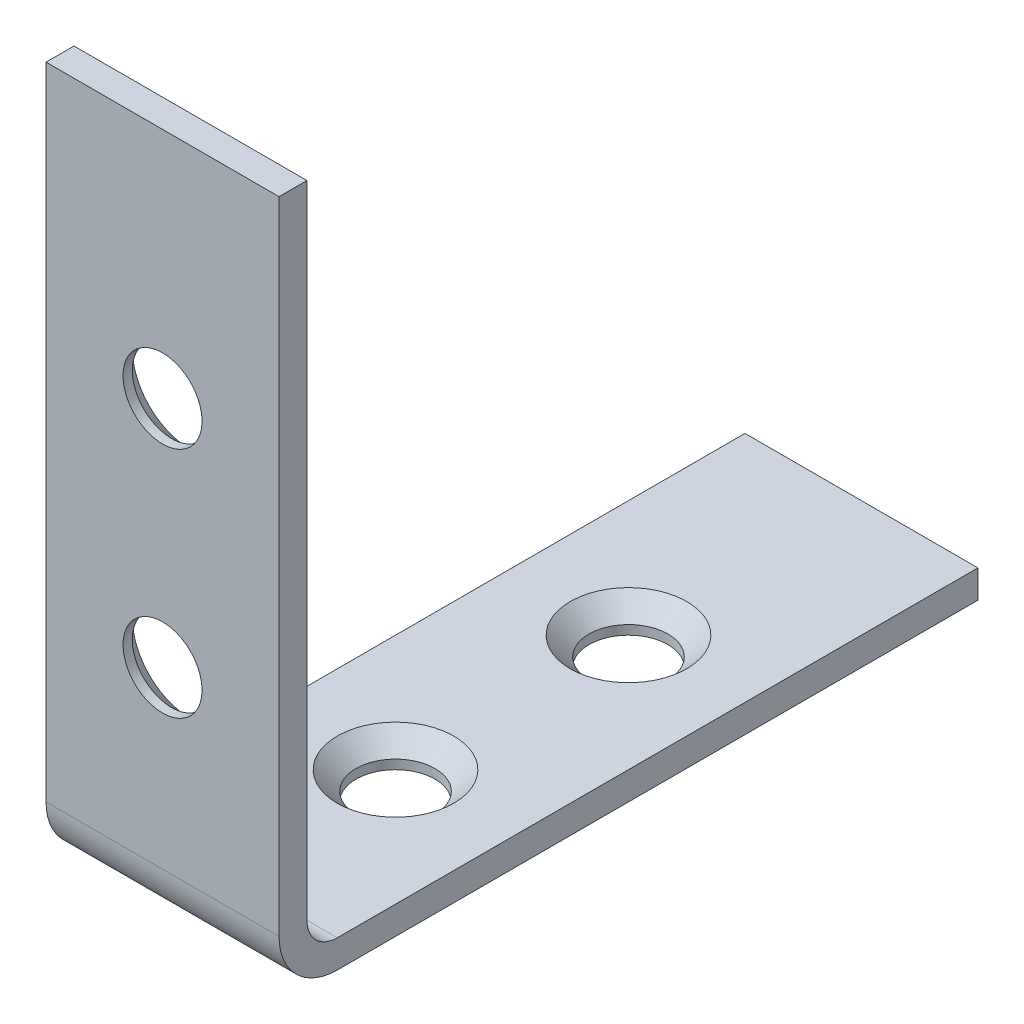
ISO-10303-21;
HEADER;
FILE_DESCRIPTION(('STEP AP214'),'2;1');
FILE_NAME('part.step','',(''),(''),'','','');
FILE_SCHEMA(('AUTOMOTIVE_DESIGN { 1 0 10303 214 1 1 1 1 }'));
ENDSEC;
DATA;
#1=APPLICATION_CONTEXT('core data for automotive mechanical design processes');
#2=APPLICATION_PROTOCOL_DEFINITION('international standard','automotive_design',2000,#1);
#3=PRODUCT_CONTEXT('',#1,'mechanical');
#4=PRODUCT('Part','Part','',(#3));
#5=PRODUCT_RELATED_PRODUCT_CATEGORY('part','',(#4));
#6=PRODUCT_DEFINITION_FORMATION('','',#4);
#7=PRODUCT_DEFINITION_CONTEXT('part definition',#1,'design');
#8=PRODUCT_DEFINITION('design','',#6,#7);
#9=PRODUCT_DEFINITION_SHAPE('','',#8);
#10=(LENGTH_UNIT() NAMED_UNIT(*) SI_UNIT(.MILLI.,.METRE.));
#11=(NAMED_UNIT(*) PLANE_ANGLE_UNIT() SI_UNIT($,.RADIAN.));
#12=(NAMED_UNIT(*) SI_UNIT($,.STERADIAN.) SOLID_ANGLE_UNIT());
#13=UNCERTAINTY_MEASURE_WITH_UNIT(LENGTH_MEASURE(1.E-05),#10,'distance_accuracy_value','');
#14=(GEOMETRIC_REPRESENTATION_CONTEXT(3) GLOBAL_UNCERTAINTY_ASSIGNED_CONTEXT((#13)) GLOBAL_UNIT_ASSIGNED_CONTEXT((#10,
#11,#12)) REPRESENTATION_CONTEXT('',''));
#15=CARTESIAN_POINT('',(0.,0.,0.));
#16=DIRECTION('',(0.,0.,1.));
#17=DIRECTION('',(1.,0.,0.));
#18=AXIS2_PLACEMENT_3D('',#15,#16,#17);
#19=CARTESIAN_POINT('',(6.35,38.1,0.));
#20=DIRECTION('',(0.,-1.,0.));
#21=DIRECTION('',(0.,0.,-1.));
#22=AXIS2_PLACEMENT_3D('',#19,#20,#21);
#23=PLANE('',#22);
#24=DIRECTION('',(0.,0.,1.));
#25=VECTOR('',#24,1.);
#26=CARTESIAN_POINT('',(-6.35,38.1,0.));
#27=LINE('',#26,#25);
#28=CARTESIAN_POINT('',(-6.35,38.1,-1.524));
#29=VERTEX_POINT('',#28);
#30=CARTESIAN_POINT('',(-6.35,38.1,0.));
#31=VERTEX_POINT('',#30);
#32=EDGE_CURVE('E134',#29,#31,#27,.T.);
#33=ORIENTED_EDGE('',*,*,#32,.T.);
#34=DIRECTION('',(-1.,0.,0.));
#35=VECTOR('',#34,1.);
#36=CARTESIAN_POINT('',(6.35,38.1,0.));
#37=LINE('',#36,#35);
#38=CARTESIAN_POINT('',(6.35,38.1,0.));
#39=VERTEX_POINT('',#38);
#40=EDGE_CURVE('E11',#39,#31,#37,.T.);
#41=ORIENTED_EDGE('',*,*,#40,.F.);
#42=DIRECTION('',(0.,0.,1.));
#43=VECTOR('',#42,1.);
#44=CARTESIAN_POINT('',(6.35,38.1,0.));
#45=LINE('',#44,#43);
#46=CARTESIAN_POINT('',(6.35,38.1,-1.524));
#47=VERTEX_POINT('',#46);
#48=EDGE_CURVE('E149',#47,#39,#45,.T.);
#49=ORIENTED_EDGE('',*,*,#48,.F.);
#50=DIRECTION('',(-1.,0.,0.));
#51=VECTOR('',#50,1.);
#52=CARTESIAN_POINT('',(6.35,38.1,-1.524));
#53=LINE('',#52,#51);
#54=EDGE_CURVE('E130',#47,#29,#53,.T.);
#55=ORIENTED_EDGE('',*,*,#54,.T.);
#56=EDGE_LOOP('',(#33,#41,#49,#55));
#57=FACE_BOUND('',#56,.T.);
#58=ADVANCED_FACE('F38',(#57),#23,.F.);
#59=CARTESIAN_POINT('',(6.35,3.175,0.));
#60=DIRECTION('',(0.,0.,-1.));
#61=DIRECTION('',(-1.,0.,0.));
#62=AXIS2_PLACEMENT_3D('',#59,#60,#61);
#63=PLANE('',#62);
#64=CARTESIAN_POINT('',(0.,12.7,0.));
#65=DIRECTION('',(0.,0.,-1.));
#66=DIRECTION('',(0.,1.,0.));
#67=AXIS2_PLACEMENT_3D('',#64,#65,#66);
#68=CIRCLE('',#67,2.15265);
#69=CARTESIAN_POINT('',(0.,14.85265,0.));
#70=VERTEX_POINT('',#69);
#71=EDGE_CURVE('E208',#70,#70,#68,.T.);
#72=ORIENTED_EDGE('',*,*,#71,.T.);
#73=EDGE_LOOP('',(#72));
#74=FACE_BOUND('',#73,.T.);
#75=CARTESIAN_POINT('',(0.,25.4,0.));
#76=DIRECTION('',(0.,0.,-1.));
#77=DIRECTION('',(0.,1.,0.));
#78=AXIS2_PLACEMENT_3D('',#75,#76,#77);
#79=CIRCLE('',#78,2.15265);
#80=CARTESIAN_POINT('',(0.,27.55265,0.));
#81=VERTEX_POINT('',#80);
#82=EDGE_CURVE('E199',#81,#81,#79,.T.);
#83=ORIENTED_EDGE('',*,*,#82,.T.);
#84=EDGE_LOOP('',(#83));
#85=FACE_BOUND('',#84,.T.);
#86=DIRECTION('',(0.,-1.,0.));
#87=VECTOR('',#86,1.);
#88=CARTESIAN_POINT('',(-6.35,3.175,0.));
#89=LINE('',#88,#87);
#90=CARTESIAN_POINT('',(-6.35,3.175,0.));
#91=VERTEX_POINT('',#90);
#92=EDGE_CURVE('E137',#31,#91,#89,.T.);
#93=ORIENTED_EDGE('',*,*,#92,.T.);
#94=DIRECTION('',(-1.,0.,0.));
#95=VECTOR('',#94,1.);
#96=CARTESIAN_POINT('',(6.35,3.175,0.));
#97=LINE('',#96,#95);
#98=CARTESIAN_POINT('',(6.35,3.175,0.));
#99=VERTEX_POINT('',#98);
#100=EDGE_CURVE('E46',#99,#91,#97,.T.);
#101=ORIENTED_EDGE('',*,*,#100,.F.);
#102=DIRECTION('',(0.,-1.,0.));
#103=VECTOR('',#102,1.);
#104=CARTESIAN_POINT('',(6.35,3.175,0.));
#105=LINE('',#104,#103);
#106=EDGE_CURVE('E97',#39,#99,#105,.T.);
#107=ORIENTED_EDGE('',*,*,#106,.F.);
#108=ORIENTED_EDGE('',*,*,#40,.T.);
#109=EDGE_LOOP('',(#93,#101,#107,#108));
#110=FACE_BOUND('',#109,.T.);
#111=ADVANCED_FACE('F243',(#74,#85,#110),#63,.F.);
#112=CARTESIAN_POINT('',(6.35,3.175,-3.175));
#113=DIRECTION('',(-1.,0.,0.));
#114=DIRECTION('',(0.,0.,1.));
#115=AXIS2_PLACEMENT_3D('',#112,#113,#114);
#116=CYLINDRICAL_SURFACE('',#115,3.175);
#117=CARTESIAN_POINT('',(-6.35,3.175,-3.175));
#118=DIRECTION('',(1.,0.,0.));
#119=DIRECTION('',(0.,0.,-1.));
#120=AXIS2_PLACEMENT_3D('',#117,#118,#119);
#121=CIRCLE('',#120,3.175);
#122=CARTESIAN_POINT('',(-6.35,0.,-3.175));
#123=VERTEX_POINT('',#122);
#124=EDGE_CURVE('E140',#91,#123,#121,.T.);
#125=ORIENTED_EDGE('',*,*,#124,.T.);
#126=DIRECTION('',(-1.,0.,0.));
#127=VECTOR('',#126,1.);
#128=CARTESIAN_POINT('',(6.35,0.,-3.175));
#129=LINE('',#128,#127);
#130=CARTESIAN_POINT('',(6.35,0.,-3.175));
#131=VERTEX_POINT('',#130);
#132=EDGE_CURVE('E156',#131,#123,#129,.T.);
#133=ORIENTED_EDGE('',*,*,#132,.F.);
#134=CARTESIAN_POINT('',(6.35,3.175,-3.175));
#135=DIRECTION('',(1.,0.,0.));
#136=DIRECTION('',(0.,0.,-1.));
#137=AXIS2_PLACEMENT_3D('',#134,#135,#136);
#138=CIRCLE('',#137,3.175);
#139=EDGE_CURVE('E164',#99,#131,#138,.T.);
#140=ORIENTED_EDGE('',*,*,#139,.F.);
#141=ORIENTED_EDGE('',*,*,#100,.T.);
#142=EDGE_LOOP('',(#125,#133,#140,#141));
#143=FACE_BOUND('',#142,.T.);
#144=ADVANCED_FACE('F162',(#143),#116,.T.);
#145=CARTESIAN_POINT('',(6.35,0.,-38.1));
#146=DIRECTION('',(0.,1.,0.));
#147=DIRECTION('',(0.,0.,1.));
#148=AXIS2_PLACEMENT_3D('',#145,#146,#147);
#149=PLANE('',#148);
#150=CARTESIAN_POINT('',(0.,0.,-25.4));
#151=DIRECTION('',(0.,1.,0.));
#152=DIRECTION('',(0.,0.,1.));
#153=AXIS2_PLACEMENT_3D('',#150,#151,#152);
#154=CIRCLE('',#153,2.15265);
#155=CARTESIAN_POINT('',(0.,0.,-23.24735));
#156=VERTEX_POINT('',#155);
#157=EDGE_CURVE('E190',#156,#156,#154,.T.);
#158=ORIENTED_EDGE('',*,*,#157,.T.);
#159=EDGE_LOOP('',(#158));
#160=FACE_BOUND('',#159,.T.);
#161=CARTESIAN_POINT('',(0.,0.,-12.7));
#162=DIRECTION('',(0.,1.,0.));
#163=DIRECTION('',(0.,0.,1.));
#164=AXIS2_PLACEMENT_3D('',#161,#162,#163);
#165=CIRCLE('',#164,2.15265);
#166=CARTESIAN_POINT('',(0.,0.,-10.54735));
#167=VERTEX_POINT('',#166);
#168=EDGE_CURVE('E138',#167,#167,#165,.T.);
#169=ORIENTED_EDGE('',*,*,#168,.T.);
#170=EDGE_LOOP('',(#169));
#171=FACE_BOUND('',#170,.T.);
#172=DIRECTION('',(0.,0.,-1.));
#173=VECTOR('',#172,1.);
#174=CARTESIAN_POINT('',(-6.35,0.,-38.1));
#175=LINE('',#174,#173);
#176=CARTESIAN_POINT('',(-6.35,0.,-38.1));
#177=VERTEX_POINT('',#176);
#178=EDGE_CURVE('E142',#123,#177,#175,.T.);
#179=ORIENTED_EDGE('',*,*,#178,.T.);
#180=DIRECTION('',(-1.,0.,0.));
#181=VECTOR('',#180,1.);
#182=CARTESIAN_POINT('',(6.35,0.,-38.1));
#183=LINE('',#182,#181);
#184=CARTESIAN_POINT('',(6.35,0.,-38.1));
#185=VERTEX_POINT('',#184);
#186=EDGE_CURVE('E153',#185,#177,#183,.T.);
#187=ORIENTED_EDGE('',*,*,#186,.F.);
#188=DIRECTION('',(0.,0.,-1.));
#189=VECTOR('',#188,1.);
#190=CARTESIAN_POINT('',(6.35,0.,-38.1));
#191=LINE('',#190,#189);
#192=EDGE_CURVE('E176',#131,#185,#191,.T.);
#193=ORIENTED_EDGE('',*,*,#192,.F.);
#194=ORIENTED_EDGE('',*,*,#132,.T.);
#195=EDGE_LOOP('',(#179,#187,#193,#194));
#196=FACE_BOUND('',#195,.T.);
#197=ADVANCED_FACE('F172',(#160,#171,#196),#149,.F.);
#198=CARTESIAN_POINT('',(6.35,1.524,-38.1));
#199=DIRECTION('',(0.,0.,1.));
#200=DIRECTION('',(1.,0.,0.));
#201=AXIS2_PLACEMENT_3D('',#198,#199,#200);
#202=PLANE('',#201);
#203=DIRECTION('',(0.,1.,0.));
#204=VECTOR('',#203,1.);
#205=CARTESIAN_POINT('',(-6.35,1.524,-38.1));
#206=LINE('',#205,#204);
#207=CARTESIAN_POINT('',(-6.35,1.524,-38.1));
#208=VERTEX_POINT('',#207);
#209=EDGE_CURVE('E144',#177,#208,#206,.T.);
#210=ORIENTED_EDGE('',*,*,#209,.T.);
#211=DIRECTION('',(-1.,0.,0.));
#212=VECTOR('',#211,1.);
#213=CARTESIAN_POINT('',(6.35,1.524,-38.1));
#214=LINE('',#213,#212);
#215=CARTESIAN_POINT('',(6.35,1.524,-38.1));
#216=VERTEX_POINT('',#215);
#217=EDGE_CURVE('E125',#216,#208,#214,.T.);
#218=ORIENTED_EDGE('',*,*,#217,.F.);
#219=DIRECTION('',(0.,1.,0.));
#220=VECTOR('',#219,1.);
#221=CARTESIAN_POINT('',(6.35,1.524,-38.1));
#222=LINE('',#221,#220);
#223=EDGE_CURVE('E116',#185,#216,#222,.T.);
#224=ORIENTED_EDGE('',*,*,#223,.F.);
#225=ORIENTED_EDGE('',*,*,#186,.T.);
#226=EDGE_LOOP('',(#210,#218,#224,#225));
#227=FACE_BOUND('',#226,.T.);
#228=ADVANCED_FACE('F175',(#227),#202,.F.);
#229=CARTESIAN_POINT('',(6.35,1.524,-3.175));
#230=DIRECTION('',(0.,-1.,0.));
#231=DIRECTION('',(0.,0.,-1.));
#232=AXIS2_PLACEMENT_3D('',#229,#230,#231);
#233=PLANE('',#232);
#234=CARTESIAN_POINT('',(0.,1.524,-25.4));
#235=DIRECTION('',(0.,1.,0.));
#236=DIRECTION('',(0.,0.,1.));
#237=AXIS2_PLACEMENT_3D('',#234,#235,#236);
#238=CIRCLE('',#237,3.175);
#239=CARTESIAN_POINT('',(0.,1.524,-22.225));
#240=VERTEX_POINT('',#239);
#241=EDGE_CURVE('E196',#240,#240,#238,.T.);
#242=ORIENTED_EDGE('',*,*,#241,.F.);
#243=EDGE_LOOP('',(#242));
#244=FACE_BOUND('',#243,.T.);
#245=CARTESIAN_POINT('',(0.,1.524,-12.7));
#246=DIRECTION('',(0.,1.,0.));
#247=DIRECTION('',(0.,0.,1.));
#248=AXIS2_PLACEMENT_3D('',#245,#246,#247);
#249=CIRCLE('',#248,3.175);
#250=CARTESIAN_POINT('',(0.,1.524,-9.525));
#251=VERTEX_POINT('',#250);
#252=EDGE_CURVE('E187',#251,#251,#249,.T.);
#253=ORIENTED_EDGE('',*,*,#252,.F.);
#254=EDGE_LOOP('',(#253));
#255=FACE_BOUND('',#254,.T.);
#256=DIRECTION('',(0.,0.,1.));
#257=VECTOR('',#256,1.);
#258=CARTESIAN_POINT('',(-6.35,1.524,-3.175));
#259=LINE('',#258,#257);
#260=CARTESIAN_POINT('',(-6.35,1.524,-3.175));
#261=VERTEX_POINT('',#260);
#262=EDGE_CURVE('E124',#208,#261,#259,.T.);
#263=ORIENTED_EDGE('',*,*,#262,.T.);
#264=DIRECTION('',(-1.,0.,0.));
#265=VECTOR('',#264,1.);
#266=CARTESIAN_POINT('',(6.35,1.524,-3.175));
#267=LINE('',#266,#265);
#268=CARTESIAN_POINT('',(6.35,1.524,-3.175));
#269=VERTEX_POINT('',#268);
#270=EDGE_CURVE('E121',#269,#261,#267,.T.);
#271=ORIENTED_EDGE('',*,*,#270,.F.);
#272=DIRECTION('',(0.,0.,1.));
#273=VECTOR('',#272,1.);
#274=CARTESIAN_POINT('',(6.35,1.524,-3.175));
#275=LINE('',#274,#273);
#276=EDGE_CURVE('E110',#216,#269,#275,.T.);
#277=ORIENTED_EDGE('',*,*,#276,.F.);
#278=ORIENTED_EDGE('',*,*,#217,.T.);
#279=EDGE_LOOP('',(#263,#271,#277,#278));
#280=FACE_BOUND('',#279,.T.);
#281=ADVANCED_FACE('F122',(#244,#255,#280),#233,.F.);
#282=CARTESIAN_POINT('',(6.35,3.175,-3.175));
#283=DIRECTION('',(-1.,0.,0.));
#284=DIRECTION('',(0.,0.,1.));
#285=AXIS2_PLACEMENT_3D('',#282,#283,#284);
#286=CYLINDRICAL_SURFACE('',#285,1.651);
#287=CARTESIAN_POINT('',(-6.35,3.175,-3.175));
#288=DIRECTION('',(-1.,0.,0.));
#289=DIRECTION('',(0.,0.,-1.));
#290=AXIS2_PLACEMENT_3D('',#287,#288,#289);
#291=CIRCLE('',#290,1.651);
#292=CARTESIAN_POINT('',(-6.35,3.175,-1.524));
#293=VERTEX_POINT('',#292);
#294=EDGE_CURVE('E83',#261,#293,#291,.T.);
#295=ORIENTED_EDGE('',*,*,#294,.T.);
#296=DIRECTION('',(-1.,0.,0.));
#297=VECTOR('',#296,1.);
#298=CARTESIAN_POINT('',(6.35,3.175,-1.524));
#299=LINE('',#298,#297);
#300=CARTESIAN_POINT('',(6.35,3.175,-1.524));
#301=VERTEX_POINT('',#300);
#302=EDGE_CURVE('E126',#301,#293,#299,.T.);
#303=ORIENTED_EDGE('',*,*,#302,.F.);
#304=CARTESIAN_POINT('',(6.35,3.175,-3.175));
#305=DIRECTION('',(-1.,0.,0.));
#306=DIRECTION('',(0.,0.,-1.));
#307=AXIS2_PLACEMENT_3D('',#304,#305,#306);
#308=CIRCLE('',#307,1.651);
#309=EDGE_CURVE('E114',#269,#301,#308,.T.);
#310=ORIENTED_EDGE('',*,*,#309,.F.);
#311=ORIENTED_EDGE('',*,*,#270,.T.);
#312=EDGE_LOOP('',(#295,#303,#310,#311));
#313=FACE_BOUND('',#312,.T.);
#314=ADVANCED_FACE('F128',(#313),#286,.F.);
#315=CARTESIAN_POINT('',(6.35,38.1,-1.524));
#316=DIRECTION('',(0.,0.,1.));
#317=DIRECTION('',(0.,-1.,0.));
#318=AXIS2_PLACEMENT_3D('',#315,#316,#317);
#319=PLANE('',#318);
#320=CARTESIAN_POINT('',(0.,12.7,-1.524));
#321=DIRECTION('',(0.,0.,-1.));
#322=DIRECTION('',(0.,1.,0.));
#323=AXIS2_PLACEMENT_3D('',#320,#321,#322);
#324=CIRCLE('',#323,3.175);
#325=CARTESIAN_POINT('',(0.,15.875,-1.524));
#326=VERTEX_POINT('',#325);
#327=EDGE_CURVE('E214',#326,#326,#324,.T.);
#328=ORIENTED_EDGE('',*,*,#327,.F.);
#329=EDGE_LOOP('',(#328));
#330=FACE_BOUND('',#329,.T.);
#331=CARTESIAN_POINT('',(0.,25.4,-1.524));
#332=DIRECTION('',(0.,0.,-1.));
#333=DIRECTION('',(0.,1.,0.));
#334=AXIS2_PLACEMENT_3D('',#331,#332,#333);
#335=CIRCLE('',#334,3.175);
#336=CARTESIAN_POINT('',(0.,28.575,-1.524));
#337=VERTEX_POINT('',#336);
#338=EDGE_CURVE('E205',#337,#337,#335,.T.);
#339=ORIENTED_EDGE('',*,*,#338,.F.);
#340=EDGE_LOOP('',(#339));
#341=FACE_BOUND('',#340,.T.);
#342=DIRECTION('',(0.,1.,0.));
#343=VECTOR('',#342,1.);
#344=CARTESIAN_POINT('',(-6.35,38.1,-1.524));
#345=LINE('',#344,#343);
#346=EDGE_CURVE('E89',#293,#29,#345,.T.);
#347=ORIENTED_EDGE('',*,*,#346,.T.);
#348=ORIENTED_EDGE('',*,*,#54,.F.);
#349=DIRECTION('',(0.,1.,0.));
#350=VECTOR('',#349,1.);
#351=CARTESIAN_POINT('',(6.35,38.1,-1.524));
#352=LINE('',#351,#350);
#353=EDGE_CURVE('E54',#301,#47,#352,.T.);
#354=ORIENTED_EDGE('',*,*,#353,.F.);
#355=ORIENTED_EDGE('',*,*,#302,.T.);
#356=EDGE_LOOP('',(#347,#348,#354,#355));
#357=FACE_BOUND('',#356,.T.);
#358=ADVANCED_FACE('F220',(#330,#341,#357),#319,.F.);
#359=CARTESIAN_POINT('',(6.35,3.175,-3.175));
#360=DIRECTION('',(1.,0.,0.));
#361=DIRECTION('',(0.,0.,-1.));
#362=AXIS2_PLACEMENT_3D('',#359,#360,#361);
#363=PLANE('',#362);
#364=ORIENTED_EDGE('',*,*,#48,.T.);
#365=ORIENTED_EDGE('',*,*,#106,.T.);
#366=ORIENTED_EDGE('',*,*,#139,.T.);
#367=ORIENTED_EDGE('',*,*,#192,.T.);
#368=ORIENTED_EDGE('',*,*,#223,.T.);
#369=ORIENTED_EDGE('',*,*,#276,.T.);
#370=ORIENTED_EDGE('',*,*,#309,.T.);
#371=ORIENTED_EDGE('',*,*,#353,.T.);
#372=EDGE_LOOP('',(#364,#365,#366,#367,#368,#369,#370,#371));
#373=FACE_BOUND('',#372,.T.);
#374=ADVANCED_FACE('F112',(#373),#363,.T.);
#375=CARTESIAN_POINT('',(-6.35,3.175,-3.175));
#376=DIRECTION('',(1.,0.,0.));
#377=DIRECTION('',(0.,0.,-1.));
#378=AXIS2_PLACEMENT_3D('',#375,#376,#377);
#379=PLANE('',#378);
#380=ORIENTED_EDGE('',*,*,#32,.F.);
#381=ORIENTED_EDGE('',*,*,#346,.F.);
#382=ORIENTED_EDGE('',*,*,#294,.F.);
#383=ORIENTED_EDGE('',*,*,#262,.F.);
#384=ORIENTED_EDGE('',*,*,#209,.F.);
#385=ORIENTED_EDGE('',*,*,#178,.F.);
#386=ORIENTED_EDGE('',*,*,#124,.F.);
#387=ORIENTED_EDGE('',*,*,#92,.F.);
#388=EDGE_LOOP('',(#380,#381,#382,#383,#384,#385,#386,#387));
#389=FACE_BOUND('',#388,.T.);
#390=ADVANCED_FACE('F168',(#389),#379,.F.);
#391=CARTESIAN_POINT('',(0.,1.524,-12.7));
#392=DIRECTION('',(0.,1.,0.));
#393=DIRECTION('',(0.,0.,1.));
#394=AXIS2_PLACEMENT_3D('',#391,#392,#393);
#395=CYLINDRICAL_SURFACE('',#394,2.15265);
#396=ORIENTED_EDGE('',*,*,#168,.F.);
#397=EDGE_LOOP('',(#396));
#398=FACE_BOUND('',#397,.T.);
#399=CARTESIAN_POINT('',(0.,0.501649999999999,-12.7));
#400=DIRECTION('',(0.,1.,0.));
#401=DIRECTION('',(0.,0.,1.));
#402=AXIS2_PLACEMENT_3D('',#399,#400,#401);
#403=CIRCLE('',#402,2.15265);
#404=CARTESIAN_POINT('',(0.,0.50165,-10.54735));
#405=VERTEX_POINT('',#404);
#406=EDGE_CURVE('E184',#405,#405,#403,.T.);
#407=ORIENTED_EDGE('',*,*,#406,.T.);
#408=EDGE_LOOP('',(#407));
#409=FACE_BOUND('',#408,.T.);
#410=ADVANCED_FACE('F269',(#398,#409),#395,.F.);
#411=CARTESIAN_POINT('',(0.,1.524,-12.7));
#412=DIRECTION('',(0.,1.,0.));
#413=DIRECTION('',(0.,0.,1.));
#414=AXIS2_PLACEMENT_3D('',#411,#412,#413);
#415=CONICAL_SURFACE('',#414,3.175,0.785398163397449);
#416=ORIENTED_EDGE('',*,*,#406,.F.);
#417=EDGE_LOOP('',(#416));
#418=FACE_BOUND('',#417,.T.);
#419=ORIENTED_EDGE('',*,*,#252,.T.);
#420=EDGE_LOOP('',(#419));
#421=FACE_BOUND('',#420,.T.);
#422=ADVANCED_FACE('F274',(#418,#421),#415,.F.);
#423=CARTESIAN_POINT('',(0.,1.524,-25.4));
#424=DIRECTION('',(0.,1.,0.));
#425=DIRECTION('',(0.,0.,1.));
#426=AXIS2_PLACEMENT_3D('',#423,#424,#425);
#427=CYLINDRICAL_SURFACE('',#426,2.15265);
#428=ORIENTED_EDGE('',*,*,#157,.F.);
#429=EDGE_LOOP('',(#428));
#430=FACE_BOUND('',#429,.T.);
#431=CARTESIAN_POINT('',(0.,0.501649999999998,-25.4));
#432=DIRECTION('',(0.,1.,0.));
#433=DIRECTION('',(0.,0.,1.));
#434=AXIS2_PLACEMENT_3D('',#431,#432,#433);
#435=CIRCLE('',#434,2.15265);
#436=CARTESIAN_POINT('',(0.,0.501649999999998,-23.24735));
#437=VERTEX_POINT('',#436);
#438=EDGE_CURVE('E193',#437,#437,#435,.T.);
#439=ORIENTED_EDGE('',*,*,#438,.T.);
#440=EDGE_LOOP('',(#439));
#441=FACE_BOUND('',#440,.T.);
#442=ADVANCED_FACE('F278',(#430,#441),#427,.F.);
#443=CARTESIAN_POINT('',(0.,1.524,-25.4));
#444=DIRECTION('',(0.,1.,0.));
#445=DIRECTION('',(0.,0.,1.));
#446=AXIS2_PLACEMENT_3D('',#443,#444,#445);
#447=CONICAL_SURFACE('',#446,3.175,0.785398163397449);
#448=ORIENTED_EDGE('',*,*,#438,.F.);
#449=EDGE_LOOP('',(#448));
#450=FACE_BOUND('',#449,.T.);
#451=ORIENTED_EDGE('',*,*,#241,.T.);
#452=EDGE_LOOP('',(#451));
#453=FACE_BOUND('',#452,.T.);
#454=ADVANCED_FACE('F238',(#450,#453),#447,.F.);
#455=CARTESIAN_POINT('',(0.,25.4,-1.524));
#456=DIRECTION('',(0.,0.,-1.));
#457=DIRECTION('',(0.,1.,0.));
#458=AXIS2_PLACEMENT_3D('',#455,#456,#457);
#459=CYLINDRICAL_SURFACE('',#458,2.15264999999999);
#460=ORIENTED_EDGE('',*,*,#82,.F.);
#461=EDGE_LOOP('',(#460));
#462=FACE_BOUND('',#461,.T.);
#463=CARTESIAN_POINT('',(0.,25.4,-0.501650000000006));
#464=DIRECTION('',(0.,0.,-1.));
#465=DIRECTION('',(0.,1.,0.));
#466=AXIS2_PLACEMENT_3D('',#463,#464,#465);
#467=CIRCLE('',#466,2.15264999999999);
#468=CARTESIAN_POINT('',(0.,27.55265,-0.501650000000005));
#469=VERTEX_POINT('',#468);
#470=EDGE_CURVE('E202',#469,#469,#467,.T.);
#471=ORIENTED_EDGE('',*,*,#470,.T.);
#472=EDGE_LOOP('',(#471));
#473=FACE_BOUND('',#472,.T.);
#474=ADVANCED_FACE('F229',(#462,#473),#459,.F.);
#475=CARTESIAN_POINT('',(0.,25.4,-1.524));
#476=DIRECTION('',(0.,0.,-1.));
#477=DIRECTION('',(0.,1.,0.));
#478=AXIS2_PLACEMENT_3D('',#475,#476,#477);
#479=CONICAL_SURFACE('',#478,3.175,0.785398163397458);
#480=ORIENTED_EDGE('',*,*,#470,.F.);
#481=EDGE_LOOP('',(#480));
#482=FACE_BOUND('',#481,.T.);
#483=ORIENTED_EDGE('',*,*,#338,.T.);
#484=EDGE_LOOP('',(#483));
#485=FACE_BOUND('',#484,.T.);
#486=ADVANCED_FACE('F226',(#482,#485),#479,.F.);
#487=CARTESIAN_POINT('',(0.,12.7,-1.524));
#488=DIRECTION('',(0.,0.,-1.));
#489=DIRECTION('',(0.,1.,0.));
#490=AXIS2_PLACEMENT_3D('',#487,#488,#489);
#491=CYLINDRICAL_SURFACE('',#490,2.15264999999999);
#492=ORIENTED_EDGE('',*,*,#71,.F.);
#493=EDGE_LOOP('',(#492));
#494=FACE_BOUND('',#493,.T.);
#495=CARTESIAN_POINT('',(0.,12.7,-0.501650000000008));
#496=DIRECTION('',(0.,0.,-1.));
#497=DIRECTION('',(0.,1.,0.));
#498=AXIS2_PLACEMENT_3D('',#495,#496,#497);
#499=CIRCLE('',#498,2.15264999999999);
#500=CARTESIAN_POINT('',(0.,14.85265,-0.501650000000007));
#501=VERTEX_POINT('',#500);
#502=EDGE_CURVE('E211',#501,#501,#499,.T.);
#503=ORIENTED_EDGE('',*,*,#502,.T.);
#504=EDGE_LOOP('',(#503));
#505=FACE_BOUND('',#504,.T.);
#506=ADVANCED_FACE('F228',(#494,#505),#491,.F.);
#507=CARTESIAN_POINT('',(0.,12.7,-1.524));
#508=DIRECTION('',(0.,0.,-1.));
#509=DIRECTION('',(0.,1.,0.));
#510=AXIS2_PLACEMENT_3D('',#507,#508,#509);
#511=CONICAL_SURFACE('',#510,3.175,0.785398163397458);
#512=ORIENTED_EDGE('',*,*,#502,.F.);
#513=EDGE_LOOP('',(#512));
#514=FACE_BOUND('',#513,.T.);
#515=ORIENTED_EDGE('',*,*,#327,.T.);
#516=EDGE_LOOP('',(#515));
#517=FACE_BOUND('',#516,.T.);
#518=ADVANCED_FACE('F218',(#514,#517),#511,.F.);
#519=CLOSED_SHELL('',(#58,#111,#144,#197,#228,#281,#314,#358,#374,#390,#410,#422,#442,#454,#474,
#486,#506,#518));
#520=MANIFOLD_SOLID_BREP('B2',#519);
#521=ADVANCED_BREP_SHAPE_REPRESENTATION('',(#18,#520),#14);
#522=SHAPE_DEFINITION_REPRESENTATION(#9,#521);
ENDSEC;
END-ISO-10303-21;
